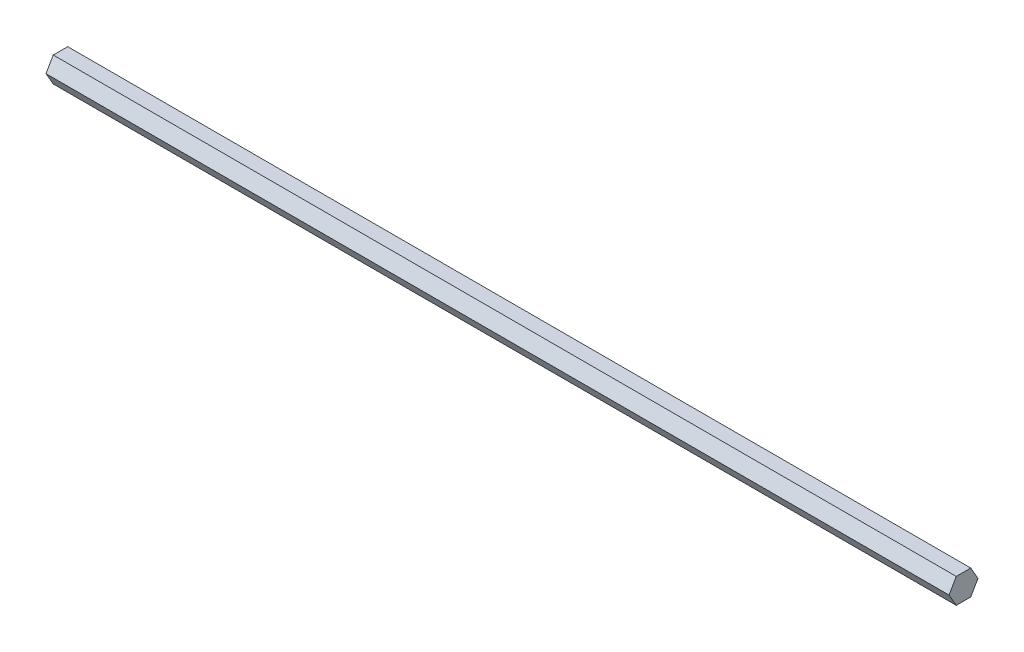
ISO-10303-21;
HEADER;
FILE_DESCRIPTION(('STEP AP214'),'2;1');
FILE_NAME('part.step','',(''),(''),'','','');
FILE_SCHEMA(('AUTOMOTIVE_DESIGN { 1 0 10303 214 1 1 1 1 }'));
ENDSEC;
DATA;
#1=APPLICATION_CONTEXT('core data for automotive mechanical design processes');
#2=APPLICATION_PROTOCOL_DEFINITION('international standard','automotive_design',2000,#1);
#3=PRODUCT_CONTEXT('',#1,'mechanical');
#4=PRODUCT('Part','Part','',(#3));
#5=PRODUCT_RELATED_PRODUCT_CATEGORY('part','',(#4));
#6=PRODUCT_DEFINITION_FORMATION('','',#4);
#7=PRODUCT_DEFINITION_CONTEXT('part definition',#1,'design');
#8=PRODUCT_DEFINITION('design','',#6,#7);
#9=PRODUCT_DEFINITION_SHAPE('','',#8);
#10=(LENGTH_UNIT() NAMED_UNIT(*) SI_UNIT(.MILLI.,.METRE.));
#11=(NAMED_UNIT(*) PLANE_ANGLE_UNIT() SI_UNIT($,.RADIAN.));
#12=(NAMED_UNIT(*) SI_UNIT($,.STERADIAN.) SOLID_ANGLE_UNIT());
#13=UNCERTAINTY_MEASURE_WITH_UNIT(LENGTH_MEASURE(1.E-05),#10,'distance_accuracy_value','');
#14=(GEOMETRIC_REPRESENTATION_CONTEXT(3) GLOBAL_UNCERTAINTY_ASSIGNED_CONTEXT((#13)) GLOBAL_UNIT_ASSIGNED_CONTEXT((#10,
#11,#12)) REPRESENTATION_CONTEXT('',''));
#15=CARTESIAN_POINT('',(0.,0.,0.));
#16=DIRECTION('',(0.,0.,1.));
#17=DIRECTION('',(1.,0.,0.));
#18=AXIS2_PLACEMENT_3D('',#15,#16,#17);
#19=CARTESIAN_POINT('',(228.6,-6.34999999999996,-3.6661742093542));
#20=DIRECTION('',(0.,0.499999999999995,0.866025403784441));
#21=DIRECTION('',(0.,-0.866025403784442,0.499999999999995));
#22=AXIS2_PLACEMENT_3D('',#19,#20,#21);
#23=PLANE('',#22);
#24=DIRECTION('',(0.,0.866025403784441,-0.499999999999995));
#25=VECTOR('',#24,1.);
#26=CARTESIAN_POINT('',(-228.6,-6.34999999999996,-3.6661742093542));
#27=LINE('',#26,#25);
#28=CARTESIAN_POINT('',(-228.6,-6.34999999999996,-3.6661742093542));
#29=VERTEX_POINT('',#28);
#30=CARTESIAN_POINT('',(-228.6,0.,-7.33234841870825));
#31=VERTEX_POINT('',#30);
#32=EDGE_CURVE('E122',#29,#31,#27,.T.);
#33=ORIENTED_EDGE('',*,*,#32,.T.);
#34=DIRECTION('',(-1.,0.,0.));
#35=VECTOR('',#34,1.);
#36=CARTESIAN_POINT('',(228.6,0.,-7.33234841870825));
#37=LINE('',#36,#35);
#38=CARTESIAN_POINT('',(228.6,0.,-7.33234841870825));
#39=VERTEX_POINT('',#38);
#40=EDGE_CURVE('E11',#39,#31,#37,.T.);
#41=ORIENTED_EDGE('',*,*,#40,.F.);
#42=DIRECTION('',(0.,0.866025403784441,-0.499999999999995));
#43=VECTOR('',#42,1.);
#44=CARTESIAN_POINT('',(228.6,-6.34999999999996,-3.6661742093542));
#45=LINE('',#44,#43);
#46=CARTESIAN_POINT('',(228.6,-6.34999999999996,-3.6661742093542));
#47=VERTEX_POINT('',#46);
#48=EDGE_CURVE('E132',#47,#39,#45,.T.);
#49=ORIENTED_EDGE('',*,*,#48,.F.);
#50=DIRECTION('',(-1.,0.,0.));
#51=VECTOR('',#50,1.);
#52=CARTESIAN_POINT('',(228.6,-6.34999999999996,-3.6661742093542));
#53=LINE('',#52,#51);
#54=EDGE_CURVE('E118',#47,#29,#53,.T.);
#55=ORIENTED_EDGE('',*,*,#54,.T.);
#56=EDGE_LOOP('',(#33,#41,#49,#55));
#57=FACE_BOUND('',#56,.T.);
#58=ADVANCED_FACE('F38',(#57),#23,.F.);
#59=CARTESIAN_POINT('',(228.6,0.,-7.33234841870825));
#60=DIRECTION('',(0.,-0.500000000000001,0.866025403784438));
#61=DIRECTION('',(0.,-0.866025403784438,-0.500000000000001));
#62=AXIS2_PLACEMENT_3D('',#59,#60,#61);
#63=PLANE('',#62);
#64=DIRECTION('',(0.,0.866025403784438,0.500000000000001));
#65=VECTOR('',#64,1.);
#66=CARTESIAN_POINT('',(-228.6,0.,-7.33234841870825));
#67=LINE('',#66,#65);
#68=CARTESIAN_POINT('',(-228.6,6.35000000000001,-3.66617420935411));
#69=VERTEX_POINT('',#68);
#70=EDGE_CURVE('E125',#31,#69,#67,.T.);
#71=ORIENTED_EDGE('',*,*,#70,.T.);
#72=DIRECTION('',(-1.,0.,0.));
#73=VECTOR('',#72,1.);
#74=CARTESIAN_POINT('',(228.6,6.35000000000001,-3.66617420935411));
#75=LINE('',#74,#73);
#76=CARTESIAN_POINT('',(228.6,6.35000000000001,-3.66617420935411));
#77=VERTEX_POINT('',#76);
#78=EDGE_CURVE('E46',#77,#69,#75,.T.);
#79=ORIENTED_EDGE('',*,*,#78,.F.);
#80=DIRECTION('',(0.,0.866025403784438,0.500000000000001));
#81=VECTOR('',#80,1.);
#82=CARTESIAN_POINT('',(228.6,0.,-7.33234841870825));
#83=LINE('',#82,#81);
#84=EDGE_CURVE('E91',#39,#77,#83,.T.);
#85=ORIENTED_EDGE('',*,*,#84,.F.);
#86=ORIENTED_EDGE('',*,*,#40,.T.);
#87=EDGE_LOOP('',(#71,#79,#85,#86));
#88=FACE_BOUND('',#87,.T.);
#89=ADVANCED_FACE('F156',(#88),#63,.F.);
#90=CARTESIAN_POINT('',(228.6,6.35000000000001,-3.66617420935411));
#91=DIRECTION('',(0.,-1.,0.));
#92=DIRECTION('',(0.,0.,-1.));
#93=AXIS2_PLACEMENT_3D('',#90,#91,#92);
#94=PLANE('',#93);
#95=DIRECTION('',(0.,0.,1.));
#96=VECTOR('',#95,1.);
#97=CARTESIAN_POINT('',(-228.6,6.35000000000001,-3.66617420935411));
#98=LINE('',#97,#96);
#99=CARTESIAN_POINT('',(-228.6,6.34999999999999,3.66617420935416));
#100=VERTEX_POINT('',#99);
#101=EDGE_CURVE('E127',#69,#100,#98,.T.);
#102=ORIENTED_EDGE('',*,*,#101,.T.);
#103=DIRECTION('',(-1.,0.,0.));
#104=VECTOR('',#103,1.);
#105=CARTESIAN_POINT('',(228.6,6.34999999999999,3.66617420935416));
#106=LINE('',#105,#104);
#107=CARTESIAN_POINT('',(228.6,6.34999999999999,3.66617420935416));
#108=VERTEX_POINT('',#107);
#109=EDGE_CURVE('E113',#108,#100,#106,.T.);
#110=ORIENTED_EDGE('',*,*,#109,.F.);
#111=DIRECTION('',(0.,0.,1.));
#112=VECTOR('',#111,1.);
#113=CARTESIAN_POINT('',(228.6,6.35000000000001,-3.66617420935411));
#114=LINE('',#113,#112);
#115=EDGE_CURVE('E104',#77,#108,#114,.T.);
#116=ORIENTED_EDGE('',*,*,#115,.F.);
#117=ORIENTED_EDGE('',*,*,#78,.T.);
#118=EDGE_LOOP('',(#102,#110,#116,#117));
#119=FACE_BOUND('',#118,.T.);
#120=ADVANCED_FACE('F138',(#119),#94,.F.);
#121=CARTESIAN_POINT('',(228.6,6.34999999999999,3.66617420935416));
#122=DIRECTION('',(0.,-0.499999999999995,-0.866025403784442));
#123=DIRECTION('',(0.,0.866025403784442,-0.499999999999995));
#124=AXIS2_PLACEMENT_3D('',#121,#122,#123);
#125=PLANE('',#124);
#126=DIRECTION('',(0.,-0.866025403784441,0.499999999999995));
#127=VECTOR('',#126,1.);
#128=CARTESIAN_POINT('',(-228.6,6.34999999999999,3.66617420935416));
#129=LINE('',#128,#127);
#130=CARTESIAN_POINT('',(-228.6,0.,7.33234841870825));
#131=VERTEX_POINT('',#130);
#132=EDGE_CURVE('E112',#100,#131,#129,.T.);
#133=ORIENTED_EDGE('',*,*,#132,.T.);
#134=DIRECTION('',(-1.,0.,0.));
#135=VECTOR('',#134,1.);
#136=CARTESIAN_POINT('',(228.6,0.,7.33234841870825));
#137=LINE('',#136,#135);
#138=CARTESIAN_POINT('',(228.6,0.,7.33234841870825));
#139=VERTEX_POINT('',#138);
#140=EDGE_CURVE('E109',#139,#131,#137,.T.);
#141=ORIENTED_EDGE('',*,*,#140,.F.);
#142=DIRECTION('',(0.,-0.866025403784441,0.499999999999995));
#143=VECTOR('',#142,1.);
#144=CARTESIAN_POINT('',(228.6,6.34999999999999,3.66617420935416));
#145=LINE('',#144,#143);
#146=EDGE_CURVE('E98',#108,#139,#145,.T.);
#147=ORIENTED_EDGE('',*,*,#146,.F.);
#148=ORIENTED_EDGE('',*,*,#109,.T.);
#149=EDGE_LOOP('',(#133,#141,#147,#148));
#150=FACE_BOUND('',#149,.T.);
#151=ADVANCED_FACE('F110',(#150),#125,.F.);
#152=CARTESIAN_POINT('',(228.6,0.,7.33234841870825));
#153=DIRECTION('',(0.,0.500000000000007,-0.866025403784434));
#154=DIRECTION('',(0.,0.866025403784435,0.500000000000007));
#155=AXIS2_PLACEMENT_3D('',#152,#153,#154);
#156=PLANE('',#155);
#157=DIRECTION('',(0.,-0.866025403784435,-0.500000000000007));
#158=VECTOR('',#157,1.);
#159=CARTESIAN_POINT('',(-228.6,0.,7.33234841870825));
#160=LINE('',#159,#158);
#161=CARTESIAN_POINT('',(-228.6,-6.35000000000004,3.66617420935407));
#162=VERTEX_POINT('',#161);
#163=EDGE_CURVE('E77',#131,#162,#160,.T.);
#164=ORIENTED_EDGE('',*,*,#163,.T.);
#165=DIRECTION('',(-1.,0.,0.));
#166=VECTOR('',#165,1.);
#167=CARTESIAN_POINT('',(228.6,-6.35000000000004,3.66617420935407));
#168=LINE('',#167,#166);
#169=CARTESIAN_POINT('',(228.6,-6.35000000000004,3.66617420935407));
#170=VERTEX_POINT('',#169);
#171=EDGE_CURVE('E114',#170,#162,#168,.T.);
#172=ORIENTED_EDGE('',*,*,#171,.F.);
#173=DIRECTION('',(0.,-0.866025403784435,-0.500000000000007));
#174=VECTOR('',#173,1.);
#175=CARTESIAN_POINT('',(228.6,0.,7.33234841870825));
#176=LINE('',#175,#174);
#177=EDGE_CURVE('E102',#139,#170,#176,.T.);
#178=ORIENTED_EDGE('',*,*,#177,.F.);
#179=ORIENTED_EDGE('',*,*,#140,.T.);
#180=EDGE_LOOP('',(#164,#172,#178,#179));
#181=FACE_BOUND('',#180,.T.);
#182=ADVANCED_FACE('F116',(#181),#156,.F.);
#183=CARTESIAN_POINT('',(228.6,-6.35000000000004,3.66617420935407));
#184=DIRECTION('',(0.,1.,0.));
#185=DIRECTION('',(0.,0.,1.));
#186=AXIS2_PLACEMENT_3D('',#183,#184,#185);
#187=PLANE('',#186);
#188=DIRECTION('',(0.,0.,-1.));
#189=VECTOR('',#188,1.);
#190=CARTESIAN_POINT('',(-228.6,-6.35000000000004,3.66617420935407));
#191=LINE('',#190,#189);
#192=EDGE_CURVE('E83',#162,#29,#191,.T.);
#193=ORIENTED_EDGE('',*,*,#192,.T.);
#194=ORIENTED_EDGE('',*,*,#54,.F.);
#195=DIRECTION('',(0.,0.,-1.));
#196=VECTOR('',#195,1.);
#197=CARTESIAN_POINT('',(228.6,-6.35000000000004,3.66617420935407));
#198=LINE('',#197,#196);
#199=EDGE_CURVE('E54',#170,#47,#198,.T.);
#200=ORIENTED_EDGE('',*,*,#199,.F.);
#201=ORIENTED_EDGE('',*,*,#171,.T.);
#202=EDGE_LOOP('',(#193,#194,#200,#201));
#203=FACE_BOUND('',#202,.T.);
#204=ADVANCED_FACE('F145',(#203),#187,.F.);
#205=CARTESIAN_POINT('',(228.6,0.,0.));
#206=DIRECTION('',(1.,0.,0.));
#207=DIRECTION('',(0.,0.,-1.));
#208=AXIS2_PLACEMENT_3D('',#205,#206,#207);
#209=PLANE('',#208);
#210=ORIENTED_EDGE('',*,*,#48,.T.);
#211=ORIENTED_EDGE('',*,*,#84,.T.);
#212=ORIENTED_EDGE('',*,*,#115,.T.);
#213=ORIENTED_EDGE('',*,*,#146,.T.);
#214=ORIENTED_EDGE('',*,*,#177,.T.);
#215=ORIENTED_EDGE('',*,*,#199,.T.);
#216=EDGE_LOOP('',(#210,#211,#212,#213,#214,#215));
#217=FACE_BOUND('',#216,.T.);
#218=ADVANCED_FACE('F100',(#217),#209,.T.);
#219=CARTESIAN_POINT('',(-228.6,0.,0.));
#220=DIRECTION('',(1.,0.,0.));
#221=DIRECTION('',(0.,0.,-1.));
#222=AXIS2_PLACEMENT_3D('',#219,#220,#221);
#223=PLANE('',#222);
#224=ORIENTED_EDGE('',*,*,#32,.F.);
#225=ORIENTED_EDGE('',*,*,#192,.F.);
#226=ORIENTED_EDGE('',*,*,#163,.F.);
#227=ORIENTED_EDGE('',*,*,#132,.F.);
#228=ORIENTED_EDGE('',*,*,#101,.F.);
#229=ORIENTED_EDGE('',*,*,#70,.F.);
#230=EDGE_LOOP('',(#224,#225,#226,#227,#228,#229));
#231=FACE_BOUND('',#230,.T.);
#232=ADVANCED_FACE('F141',(#231),#223,.F.);
#233=CLOSED_SHELL('',(#58,#89,#120,#151,#182,#204,#218,#232));
#234=MANIFOLD_SOLID_BREP('B2',#233);
#235=ADVANCED_BREP_SHAPE_REPRESENTATION('',(#18,#234),#14);
#236=SHAPE_DEFINITION_REPRESENTATION(#9,#235);
ENDSEC;
END-ISO-10303-21;
